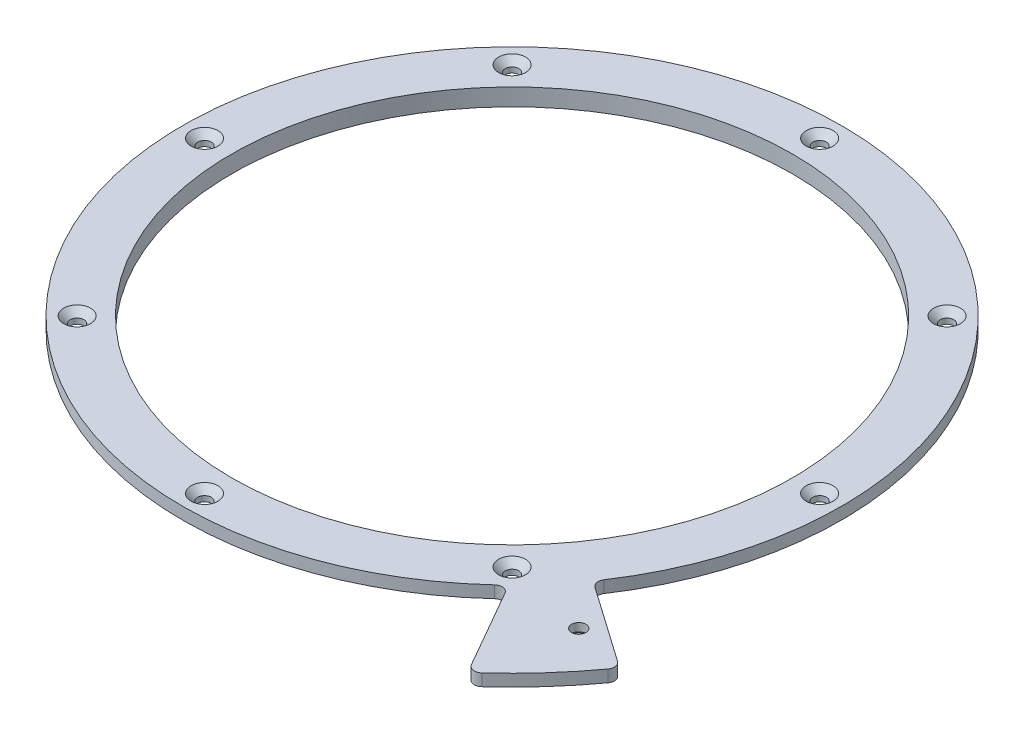
ISO-10303-21;
HEADER;
FILE_DESCRIPTION(('STEP AP214'),'2;1');
FILE_NAME('part.step','',(''),(''),'','','');
FILE_SCHEMA(('AUTOMOTIVE_DESIGN { 1 0 10303 214 1 1 1 1 }'));
ENDSEC;
DATA;
#1=APPLICATION_CONTEXT('core data for automotive mechanical design processes');
#2=APPLICATION_PROTOCOL_DEFINITION('international standard','automotive_design',2000,#1);
#3=PRODUCT_CONTEXT('',#1,'mechanical');
#4=PRODUCT('Part','Part','',(#3));
#5=PRODUCT_RELATED_PRODUCT_CATEGORY('part','',(#4));
#6=PRODUCT_DEFINITION_FORMATION('','',#4);
#7=PRODUCT_DEFINITION_CONTEXT('part definition',#1,'design');
#8=PRODUCT_DEFINITION('design','',#6,#7);
#9=PRODUCT_DEFINITION_SHAPE('','',#8);
#10=(LENGTH_UNIT() NAMED_UNIT(*) SI_UNIT(.MILLI.,.METRE.));
#11=(NAMED_UNIT(*) PLANE_ANGLE_UNIT() SI_UNIT($,.RADIAN.));
#12=(NAMED_UNIT(*) SI_UNIT($,.STERADIAN.) SOLID_ANGLE_UNIT());
#13=UNCERTAINTY_MEASURE_WITH_UNIT(LENGTH_MEASURE(1.E-05),#10,'distance_accuracy_value','');
#14=(GEOMETRIC_REPRESENTATION_CONTEXT(3) GLOBAL_UNCERTAINTY_ASSIGNED_CONTEXT((#13)) GLOBAL_UNIT_ASSIGNED_CONTEXT((#10,
#11,#12)) REPRESENTATION_CONTEXT('',''));
#15=CARTESIAN_POINT('',(0.,0.,0.));
#16=DIRECTION('',(0.,0.,1.));
#17=DIRECTION('',(1.,0.,0.));
#18=AXIS2_PLACEMENT_3D('',#15,#16,#17);
#19=CARTESIAN_POINT('',(0.,3.,0.));
#20=DIRECTION('',(0.,1.,0.));
#21=DIRECTION('',(0.,0.,1.));
#22=AXIS2_PLACEMENT_3D('',#19,#20,#21);
#23=PLANE('',#22);
#24=CARTESIAN_POINT('',(75.866996656666,3.,59.2265159041362));
#25=DIRECTION('',(0.,1.,0.));
#26=DIRECTION('',(0.,0.,1.));
#27=AXIS2_PLACEMENT_3D('',#24,#25,#26);
#28=CIRCLE('',#27,1.79999999999999);
#29=CARTESIAN_POINT('',(75.866996656666,3.,61.0265159041362));
#30=VERTEX_POINT('',#29);
#31=EDGE_CURVE('E260',#30,#30,#28,.T.);
#32=ORIENTED_EDGE('',*,*,#31,.F.);
#33=EDGE_LOOP('',(#32));
#34=FACE_BOUND('',#33,.T.);
#35=CARTESIAN_POINT('',(-76.76,3.,0.));
#36=DIRECTION('',(0.,1.,0.));
#37=DIRECTION('',(0.,0.,1.));
#38=AXIS2_PLACEMENT_3D('',#35,#36,#37);
#39=CIRCLE('',#38,3.36);
#40=CARTESIAN_POINT('',(-76.76,3.,3.36));
#41=VERTEX_POINT('',#40);
#42=EDGE_CURVE('E242',#41,#41,#39,.T.);
#43=ORIENTED_EDGE('',*,*,#42,.F.);
#44=EDGE_LOOP('',(#43));
#45=FACE_BOUND('',#44,.T.);
#46=CARTESIAN_POINT('',(-54.2775165238794,3.,-54.2775165238794));
#47=DIRECTION('',(0.,1.,0.));
#48=DIRECTION('',(0.,0.,1.));
#49=AXIS2_PLACEMENT_3D('',#46,#47,#48);
#50=CIRCLE('',#49,3.36);
#51=CARTESIAN_POINT('',(-54.2775165238794,3.,-50.9175165238794));
#52=VERTEX_POINT('',#51);
#53=EDGE_CURVE('E232',#52,#52,#50,.T.);
#54=ORIENTED_EDGE('',*,*,#53,.F.);
#55=EDGE_LOOP('',(#54));
#56=FACE_BOUND('',#55,.T.);
#57=CARTESIAN_POINT('',(0.,3.,-76.76));
#58=DIRECTION('',(0.,1.,0.));
#59=DIRECTION('',(0.,0.,1.));
#60=AXIS2_PLACEMENT_3D('',#57,#58,#59);
#61=CIRCLE('',#60,3.36);
#62=CARTESIAN_POINT('',(0.,3.,-73.4));
#63=VERTEX_POINT('',#62);
#64=EDGE_CURVE('E228',#63,#63,#61,.T.);
#65=ORIENTED_EDGE('',*,*,#64,.F.);
#66=EDGE_LOOP('',(#65));
#67=FACE_BOUND('',#66,.T.);
#68=CARTESIAN_POINT('',(54.2775165238794,3.,-54.2775165238794));
#69=DIRECTION('',(0.,1.,0.));
#70=DIRECTION('',(0.,0.,1.));
#71=AXIS2_PLACEMENT_3D('',#68,#69,#70);
#72=CIRCLE('',#71,3.36);
#73=CARTESIAN_POINT('',(54.2775165238794,3.,-50.9175165238794));
#74=VERTEX_POINT('',#73);
#75=EDGE_CURVE('E217',#74,#74,#72,.T.);
#76=ORIENTED_EDGE('',*,*,#75,.F.);
#77=EDGE_LOOP('',(#76));
#78=FACE_BOUND('',#77,.T.);
#79=CARTESIAN_POINT('',(76.76,3.,0.));
#80=DIRECTION('',(0.,1.,0.));
#81=DIRECTION('',(0.,0.,1.));
#82=AXIS2_PLACEMENT_3D('',#79,#80,#81);
#83=CIRCLE('',#82,3.36);
#84=CARTESIAN_POINT('',(76.76,3.,3.35999999999999));
#85=VERTEX_POINT('',#84);
#86=EDGE_CURVE('E206',#85,#85,#83,.T.);
#87=ORIENTED_EDGE('',*,*,#86,.F.);
#88=EDGE_LOOP('',(#87));
#89=FACE_BOUND('',#88,.T.);
#90=CARTESIAN_POINT('',(54.2775165238794,3.,54.2775165238794));
#91=DIRECTION('',(0.,1.,0.));
#92=DIRECTION('',(0.,0.,1.));
#93=AXIS2_PLACEMENT_3D('',#90,#91,#92);
#94=CIRCLE('',#93,3.36);
#95=CARTESIAN_POINT('',(54.2775165238794,3.,57.6375165238794));
#96=VERTEX_POINT('',#95);
#97=EDGE_CURVE('E198',#96,#96,#94,.T.);
#98=ORIENTED_EDGE('',*,*,#97,.F.);
#99=EDGE_LOOP('',(#98));
#100=FACE_BOUND('',#99,.T.);
#101=CARTESIAN_POINT('',(0.,3.,76.76));
#102=DIRECTION('',(0.,1.,0.));
#103=DIRECTION('',(0.,0.,1.));
#104=AXIS2_PLACEMENT_3D('',#101,#102,#103);
#105=CIRCLE('',#104,3.36);
#106=CARTESIAN_POINT('',(0.,3.,80.12));
#107=VERTEX_POINT('',#106);
#108=EDGE_CURVE('E188',#107,#107,#105,.T.);
#109=ORIENTED_EDGE('',*,*,#108,.F.);
#110=EDGE_LOOP('',(#109));
#111=FACE_BOUND('',#110,.T.);
#112=CARTESIAN_POINT('',(-54.2775165238794,3.,54.2775165238794));
#113=DIRECTION('',(0.,1.,0.));
#114=DIRECTION('',(0.,0.,1.));
#115=AXIS2_PLACEMENT_3D('',#112,#113,#114);
#116=CIRCLE('',#115,3.36);
#117=CARTESIAN_POINT('',(-54.2775165238794,3.,57.6375165238794));
#118=VERTEX_POINT('',#117);
#119=EDGE_CURVE('E181',#118,#118,#116,.T.);
#120=ORIENTED_EDGE('',*,*,#119,.F.);
#121=EDGE_LOOP('',(#120));
#122=FACE_BOUND('',#121,.T.);
#123=CARTESIAN_POINT('',(0.,3.,0.));
#124=DIRECTION('',(0.,1.,0.));
#125=DIRECTION('',(0.,0.,1.));
#126=AXIS2_PLACEMENT_3D('',#123,#124,#125);
#127=CIRCLE('',#126,109.237539335157);
#128=CARTESIAN_POINT('',(73.3680210890665,3.,80.9319064490284));
#129=VERTEX_POINT('',#128);
#130=CARTESIAN_POINT('',(88.2980425566925,3.,64.314039529923));
#131=VERTEX_POINT('',#130);
#132=EDGE_CURVE('E251',#129,#131,#127,.T.);
#133=ORIENTED_EDGE('',*,*,#132,.T.);
#134=CARTESIAN_POINT('',(86.6814180319349,3.,63.1365315061914));
#135=DIRECTION('',(0.,1.,0.));
#136=DIRECTION('',(0.,0.,1.));
#137=AXIS2_PLACEMENT_3D('',#134,#135,#136);
#138=CIRCLE('',#137,2.);
#139=CARTESIAN_POINT('',(87.828570904637,3.,61.4982274176134));
#140=VERTEX_POINT('',#139);
#141=EDGE_CURVE('E60',#131,#140,#138,.T.);
#142=ORIENTED_EDGE('',*,*,#141,.T.);
#143=DIRECTION('',(-0.819152044288989,0.,-0.573576436351051));
#144=VECTOR('',#143,1.);
#145=CARTESIAN_POINT('',(89.4821536594928,3.,62.6560785276171));
#146=LINE('',#145,#144);
#147=CARTESIAN_POINT('',(69.0023050743767,3.,48.3159341669251));
#148=VERTEX_POINT('',#147);
#149=EDGE_CURVE('E249',#140,#148,#146,.T.);
#150=ORIENTED_EDGE('',*,*,#149,.T.);
#151=CARTESIAN_POINT('',(70.1494579470788,3.,46.6776300783472));
#152=DIRECTION('',(0.,1.,0.));
#153=DIRECTION('',(0.,0.,1.));
#154=AXIS2_PLACEMENT_3D('',#151,#152,#153);
#155=CIRCLE('',#154,2.);
#156=CARTESIAN_POINT('',(68.4843865502813,3.,45.5696872803802));
#157=VERTEX_POINT('',#156);
#158=EDGE_CURVE('E140',#148,#157,#155,.F.);
#159=ORIENTED_EDGE('',*,*,#158,.T.);
#160=CARTESIAN_POINT('',(0.,3.,0.));
#161=DIRECTION('',(0.,1.,0.));
#162=DIRECTION('',(0.,0.,1.));
#163=AXIS2_PLACEMENT_3D('',#160,#161,#162);
#164=CIRCLE('',#163,82.26);
#165=CARTESIAN_POINT('',(55.9335518505812,3.,60.3170405223792));
#166=VERTEX_POINT('',#165);
#167=EDGE_CURVE('E120',#157,#166,#164,.T.);
#168=ORIENTED_EDGE('',*,*,#167,.T.);
#169=CARTESIAN_POINT('',(57.2934728778261,3.,61.7835379821988));
#170=DIRECTION('',(0.,1.,0.));
#171=DIRECTION('',(0.,0.,1.));
#172=AXIS2_PLACEMENT_3D('',#169,#170,#171);
#173=CIRCLE('',#172,2.);
#174=CARTESIAN_POINT('',(59.0288525702412,3.,60.7893260716117));
#175=VERTEX_POINT('',#174);
#176=EDGE_CURVE('E141',#166,#175,#173,.F.);
#177=ORIENTED_EDGE('',*,*,#176,.T.);
#178=DIRECTION('',(0.497105955293568,0.,0.867689846207543));
#179=VECTOR('',#178,1.);
#180=CARTESIAN_POINT('',(59.6286750276834,3.,61.8363057955671));
#181=LINE('',#180,#179);
#182=CARTESIAN_POINT('',(70.2893665199817,3.,80.4443583906232));
#183=VERTEX_POINT('',#182);
#184=EDGE_CURVE('E259',#175,#183,#181,.T.);
#185=ORIENTED_EDGE('',*,*,#184,.T.);
#186=CARTESIAN_POINT('',(72.0247462123967,3.,79.4501464800361));
#187=DIRECTION('',(0.,1.,0.));
#188=DIRECTION('',(0.,0.,1.));
#189=AXIS2_PLACEMENT_3D('',#186,#187,#188);
#190=CIRCLE('',#189,2.);
#191=EDGE_CURVE('E62',#183,#129,#190,.T.);
#192=ORIENTED_EDGE('',*,*,#191,.T.);
#193=EDGE_LOOP('',(#133,#142,#150,#159,#168,#177,#185,#192));
#194=FACE_BOUND('',#193,.T.);
#195=CARTESIAN_POINT('',(0.,3.,0.));
#196=DIRECTION('',(0.,1.,0.));
#197=DIRECTION('',(0.,0.,1.));
#198=AXIS2_PLACEMENT_3D('',#195,#196,#197);
#199=CIRCLE('',#198,70.);
#200=CARTESIAN_POINT('',(0.,3.,70.));
#201=VERTEX_POINT('',#200);
#202=EDGE_CURVE('E131',#201,#201,#199,.T.);
#203=ORIENTED_EDGE('',*,*,#202,.F.);
#204=EDGE_LOOP('',(#203));
#205=FACE_BOUND('',#204,.T.);
#206=ADVANCED_FACE('F41',(#34,#45,#56,#67,#78,#89,#100,#111,#122,#194,#205),#23,.T.);
#207=CARTESIAN_POINT('',(0.,0.,0.));
#208=DIRECTION('',(0.,1.,0.));
#209=DIRECTION('',(0.,0.,1.));
#210=AXIS2_PLACEMENT_3D('',#207,#208,#209);
#211=PLANE('',#210);
#212=CARTESIAN_POINT('',(75.866996656666,0.,59.2265159041362));
#213=DIRECTION('',(0.,1.,0.));
#214=DIRECTION('',(0.,0.,1.));
#215=AXIS2_PLACEMENT_3D('',#212,#213,#214);
#216=CIRCLE('',#215,2.79999999999988);
#217=CARTESIAN_POINT('',(75.866996656666,0.,62.0265159041361));
#218=VERTEX_POINT('',#217);
#219=EDGE_CURVE('E49',#218,#218,#216,.T.);
#220=ORIENTED_EDGE('',*,*,#219,.T.);
#221=EDGE_LOOP('',(#220));
#222=FACE_BOUND('',#221,.T.);
#223=CARTESIAN_POINT('',(-76.76,0.,0.));
#224=DIRECTION('',(0.,1.,0.));
#225=DIRECTION('',(0.,0.,1.));
#226=AXIS2_PLACEMENT_3D('',#223,#224,#225);
#227=CIRCLE('',#226,1.69999999999999);
#228=CARTESIAN_POINT('',(-76.76,0.,1.69999999999999));
#229=VERTEX_POINT('',#228);
#230=EDGE_CURVE('E238',#229,#229,#227,.T.);
#231=ORIENTED_EDGE('',*,*,#230,.T.);
#232=EDGE_LOOP('',(#231));
#233=FACE_BOUND('',#232,.T.);
#234=CARTESIAN_POINT('',(-54.2775165238794,0.,-54.2775165238794));
#235=DIRECTION('',(0.,1.,0.));
#236=DIRECTION('',(0.,0.,1.));
#237=AXIS2_PLACEMENT_3D('',#234,#235,#236);
#238=CIRCLE('',#237,1.7);
#239=CARTESIAN_POINT('',(-54.2775165238794,0.,-52.5775165238794));
#240=VERTEX_POINT('',#239);
#241=EDGE_CURVE('E230',#240,#240,#238,.T.);
#242=ORIENTED_EDGE('',*,*,#241,.T.);
#243=EDGE_LOOP('',(#242));
#244=FACE_BOUND('',#243,.T.);
#245=CARTESIAN_POINT('',(0.,0.,-76.76));
#246=DIRECTION('',(0.,1.,0.));
#247=DIRECTION('',(0.,0.,1.));
#248=AXIS2_PLACEMENT_3D('',#245,#246,#247);
#249=CIRCLE('',#248,1.7);
#250=CARTESIAN_POINT('',(0.,0.,-75.06));
#251=VERTEX_POINT('',#250);
#252=EDGE_CURVE('E220',#251,#251,#249,.T.);
#253=ORIENTED_EDGE('',*,*,#252,.T.);
#254=EDGE_LOOP('',(#253));
#255=FACE_BOUND('',#254,.T.);
#256=CARTESIAN_POINT('',(54.2775165238794,0.,-54.2775165238794));
#257=DIRECTION('',(0.,1.,0.));
#258=DIRECTION('',(0.,0.,1.));
#259=AXIS2_PLACEMENT_3D('',#256,#257,#258);
#260=CIRCLE('',#259,1.7);
#261=CARTESIAN_POINT('',(54.2775165238794,0.,-52.5775165238794));
#262=VERTEX_POINT('',#261);
#263=EDGE_CURVE('E214',#262,#262,#260,.T.);
#264=ORIENTED_EDGE('',*,*,#263,.T.);
#265=EDGE_LOOP('',(#264));
#266=FACE_BOUND('',#265,.T.);
#267=CARTESIAN_POINT('',(76.76,0.,0.));
#268=DIRECTION('',(0.,1.,0.));
#269=DIRECTION('',(0.,0.,1.));
#270=AXIS2_PLACEMENT_3D('',#267,#268,#269);
#271=CIRCLE('',#270,1.69999999999999);
#272=CARTESIAN_POINT('',(76.76,0.,1.69999999999998));
#273=VERTEX_POINT('',#272);
#274=EDGE_CURVE('E205',#273,#273,#271,.T.);
#275=ORIENTED_EDGE('',*,*,#274,.T.);
#276=EDGE_LOOP('',(#275));
#277=FACE_BOUND('',#276,.T.);
#278=CARTESIAN_POINT('',(54.2775165238794,0.,54.2775165238794));
#279=DIRECTION('',(0.,1.,0.));
#280=DIRECTION('',(0.,0.,1.));
#281=AXIS2_PLACEMENT_3D('',#278,#279,#280);
#282=CIRCLE('',#281,1.7);
#283=CARTESIAN_POINT('',(54.2775165238794,0.,55.9775165238794));
#284=VERTEX_POINT('',#283);
#285=EDGE_CURVE('E195',#284,#284,#282,.T.);
#286=ORIENTED_EDGE('',*,*,#285,.T.);
#287=EDGE_LOOP('',(#286));
#288=FACE_BOUND('',#287,.T.);
#289=CARTESIAN_POINT('',(0.,0.,76.76));
#290=DIRECTION('',(0.,1.,0.));
#291=DIRECTION('',(0.,0.,1.));
#292=AXIS2_PLACEMENT_3D('',#289,#290,#291);
#293=CIRCLE('',#292,1.7);
#294=CARTESIAN_POINT('',(0.,0.,78.46));
#295=VERTEX_POINT('',#294);
#296=EDGE_CURVE('E183',#295,#295,#293,.T.);
#297=ORIENTED_EDGE('',*,*,#296,.T.);
#298=EDGE_LOOP('',(#297));
#299=FACE_BOUND('',#298,.T.);
#300=CARTESIAN_POINT('',(-54.2775165238794,0.,54.2775165238794));
#301=DIRECTION('',(0.,1.,0.));
#302=DIRECTION('',(0.,0.,1.));
#303=AXIS2_PLACEMENT_3D('',#300,#301,#302);
#304=CIRCLE('',#303,1.7);
#305=CARTESIAN_POINT('',(-54.2775165238794,0.,55.9775165238794));
#306=VERTEX_POINT('',#305);
#307=EDGE_CURVE('E174',#306,#306,#304,.T.);
#308=ORIENTED_EDGE('',*,*,#307,.T.);
#309=EDGE_LOOP('',(#308));
#310=FACE_BOUND('',#309,.T.);
#311=CARTESIAN_POINT('',(0.,0.,0.));
#312=DIRECTION('',(0.,-1.,0.));
#313=DIRECTION('',(0.,0.,-1.));
#314=AXIS2_PLACEMENT_3D('',#311,#312,#313);
#315=CIRCLE('',#314,73.);
#316=CARTESIAN_POINT('',(0.,0.,-73.));
#317=VERTEX_POINT('',#316);
#318=EDGE_CURVE('E122',#317,#317,#315,.T.);
#319=ORIENTED_EDGE('',*,*,#318,.F.);
#320=EDGE_LOOP('',(#319));
#321=FACE_BOUND('',#320,.T.);
#322=DIRECTION('',(0.819152044288989,0.,0.573576436351051));
#323=VECTOR('',#322,1.);
#324=CARTESIAN_POINT('',(89.4821536594928,0.,62.6560785276171));
#325=LINE('',#324,#323);
#326=CARTESIAN_POINT('',(69.0023050743767,0.,48.3159341669251));
#327=VERTEX_POINT('',#326);
#328=CARTESIAN_POINT('',(87.828570904637,0.,61.4982274176134));
#329=VERTEX_POINT('',#328);
#330=EDGE_CURVE('E248',#327,#329,#325,.T.);
#331=ORIENTED_EDGE('',*,*,#330,.T.);
#332=CARTESIAN_POINT('',(86.6814180319349,0.,63.1365315061914));
#333=DIRECTION('',(0.,1.,0.));
#334=DIRECTION('',(0.,0.,1.));
#335=AXIS2_PLACEMENT_3D('',#332,#333,#334);
#336=CIRCLE('',#335,2.);
#337=CARTESIAN_POINT('',(88.2980425566925,0.,64.314039529923));
#338=VERTEX_POINT('',#337);
#339=EDGE_CURVE('E143',#329,#338,#336,.F.);
#340=ORIENTED_EDGE('',*,*,#339,.T.);
#341=CARTESIAN_POINT('',(0.,0.,0.));
#342=DIRECTION('',(0.,1.,0.));
#343=DIRECTION('',(0.,0.,1.));
#344=AXIS2_PLACEMENT_3D('',#341,#342,#343);
#345=CIRCLE('',#344,109.237539335157);
#346=CARTESIAN_POINT('',(73.3680210890665,0.,80.9319064490284));
#347=VERTEX_POINT('',#346);
#348=EDGE_CURVE('E254',#338,#347,#345,.F.);
#349=ORIENTED_EDGE('',*,*,#348,.T.);
#350=CARTESIAN_POINT('',(72.0247462123967,0.,79.4501464800361));
#351=DIRECTION('',(0.,1.,0.));
#352=DIRECTION('',(0.,0.,1.));
#353=AXIS2_PLACEMENT_3D('',#350,#351,#352);
#354=CIRCLE('',#353,2.);
#355=CARTESIAN_POINT('',(70.2893665199817,0.,80.4443583906232));
#356=VERTEX_POINT('',#355);
#357=EDGE_CURVE('E146',#347,#356,#354,.F.);
#358=ORIENTED_EDGE('',*,*,#357,.T.);
#359=DIRECTION('',(-0.497105955293568,0.,-0.867689846207543));
#360=VECTOR('',#359,1.);
#361=CARTESIAN_POINT('',(59.6286750276834,0.,61.8363057955671));
#362=LINE('',#361,#360);
#363=CARTESIAN_POINT('',(59.0288525702412,0.,60.7893260716117));
#364=VERTEX_POINT('',#363);
#365=EDGE_CURVE('E250',#356,#364,#362,.T.);
#366=ORIENTED_EDGE('',*,*,#365,.T.);
#367=CARTESIAN_POINT('',(57.2934728778261,0.,61.7835379821988));
#368=DIRECTION('',(0.,1.,0.));
#369=DIRECTION('',(0.,0.,1.));
#370=AXIS2_PLACEMENT_3D('',#367,#368,#369);
#371=CIRCLE('',#370,2.);
#372=CARTESIAN_POINT('',(55.9335518505812,0.,60.3170405223792));
#373=VERTEX_POINT('',#372);
#374=EDGE_CURVE('E127',#364,#373,#371,.T.);
#375=ORIENTED_EDGE('',*,*,#374,.T.);
#376=CARTESIAN_POINT('',(0.,0.,0.));
#377=DIRECTION('',(0.,1.,0.));
#378=DIRECTION('',(0.,0.,1.));
#379=AXIS2_PLACEMENT_3D('',#376,#377,#378);
#380=CIRCLE('',#379,82.26);
#381=CARTESIAN_POINT('',(68.4843865502813,0.,45.5696872803802));
#382=VERTEX_POINT('',#381);
#383=EDGE_CURVE('E112',#382,#373,#380,.T.);
#384=ORIENTED_EDGE('',*,*,#383,.F.);
#385=CARTESIAN_POINT('',(70.1494579470788,0.,46.6776300783472));
#386=DIRECTION('',(0.,1.,0.));
#387=DIRECTION('',(0.,0.,1.));
#388=AXIS2_PLACEMENT_3D('',#385,#386,#387);
#389=CIRCLE('',#388,2.);
#390=EDGE_CURVE('E129',#382,#327,#389,.T.);
#391=ORIENTED_EDGE('',*,*,#390,.T.);
#392=EDGE_LOOP('',(#331,#340,#349,#358,#366,#375,#384,#391));
#393=FACE_BOUND('',#392,.T.);
#394=ADVANCED_FACE('F123',(#222,#233,#244,#255,#266,#277,#288,#299,#310,#321,#393),#211,.F.);
#395=CARTESIAN_POINT('',(0.,3.,0.));
#396=DIRECTION('',(0.,-1.,0.));
#397=DIRECTION('',(0.,0.,-1.));
#398=AXIS2_PLACEMENT_3D('',#395,#396,#397);
#399=CYLINDRICAL_SURFACE('',#398,82.26);
#400=ORIENTED_EDGE('',*,*,#383,.T.);
#401=DIRECTION('',(0.,-1.,0.));
#402=VECTOR('',#401,1.);
#403=CARTESIAN_POINT('',(55.9335518505813,3.,60.3170405223792));
#404=LINE('',#403,#402);
#405=EDGE_CURVE('E119',#373,#166,#404,.F.);
#406=ORIENTED_EDGE('',*,*,#405,.T.);
#407=ORIENTED_EDGE('',*,*,#167,.F.);
#408=DIRECTION('',(0.,-1.,0.));
#409=VECTOR('',#408,1.);
#410=CARTESIAN_POINT('',(68.4843865502813,3.,45.5696872803802));
#411=LINE('',#410,#409);
#412=EDGE_CURVE('E109',#157,#382,#411,.T.);
#413=ORIENTED_EDGE('',*,*,#412,.T.);
#414=EDGE_LOOP('',(#400,#406,#407,#413));
#415=FACE_BOUND('',#414,.T.);
#416=ADVANCED_FACE('F115',(#415),#399,.T.);
#417=CARTESIAN_POINT('',(0.,3.,0.));
#418=DIRECTION('',(0.,-1.,0.));
#419=DIRECTION('',(0.,0.,-1.));
#420=AXIS2_PLACEMENT_3D('',#417,#418,#419);
#421=CYLINDRICAL_SURFACE('',#420,70.);
#422=ORIENTED_EDGE('',*,*,#202,.T.);
#423=EDGE_LOOP('',(#422));
#424=FACE_BOUND('',#423,.T.);
#425=CARTESIAN_POINT('',(0.,-1.3,0.));
#426=DIRECTION('',(0.,-1.,0.));
#427=DIRECTION('',(0.,0.,-1.));
#428=AXIS2_PLACEMENT_3D('',#425,#426,#427);
#429=CIRCLE('',#428,70.);
#430=CARTESIAN_POINT('',(0.,-1.3,-70.));
#431=VERTEX_POINT('',#430);
#432=EDGE_CURVE('E175',#431,#431,#429,.T.);
#433=ORIENTED_EDGE('',*,*,#432,.T.);
#434=EDGE_LOOP('',(#433));
#435=FACE_BOUND('',#434,.T.);
#436=ADVANCED_FACE('F286',(#424,#435),#421,.F.);
#437=CARTESIAN_POINT('',(0.,-1.3,0.));
#438=DIRECTION('',(0.,-1.,0.));
#439=DIRECTION('',(0.,0.,-1.));
#440=AXIS2_PLACEMENT_3D('',#437,#438,#439);
#441=PLANE('',#440);
#442=CARTESIAN_POINT('',(0.,-1.3,0.));
#443=DIRECTION('',(0.,-1.,0.));
#444=DIRECTION('',(0.,0.,-1.));
#445=AXIS2_PLACEMENT_3D('',#442,#443,#444);
#446=CIRCLE('',#445,73.);
#447=CARTESIAN_POINT('',(0.,-1.3,-73.));
#448=VERTEX_POINT('',#447);
#449=EDGE_CURVE('E170',#448,#448,#446,.T.);
#450=ORIENTED_EDGE('',*,*,#449,.T.);
#451=EDGE_LOOP('',(#450));
#452=FACE_BOUND('',#451,.T.);
#453=ORIENTED_EDGE('',*,*,#432,.F.);
#454=EDGE_LOOP('',(#453));
#455=FACE_BOUND('',#454,.T.);
#456=ADVANCED_FACE('F293',(#452,#455),#441,.T.);
#457=CARTESIAN_POINT('',(0.,-1.3,0.));
#458=DIRECTION('',(0.,1.,0.));
#459=DIRECTION('',(0.,0.,1.));
#460=AXIS2_PLACEMENT_3D('',#457,#458,#459);
#461=CYLINDRICAL_SURFACE('',#460,73.);
#462=ORIENTED_EDGE('',*,*,#449,.F.);
#463=EDGE_LOOP('',(#462));
#464=FACE_BOUND('',#463,.T.);
#465=ORIENTED_EDGE('',*,*,#318,.T.);
#466=EDGE_LOOP('',(#465));
#467=FACE_BOUND('',#466,.T.);
#468=ADVANCED_FACE('F298',(#464,#467),#461,.T.);
#469=CARTESIAN_POINT('',(-54.2775165238794,3.,54.2775165238794));
#470=DIRECTION('',(0.,1.,0.));
#471=DIRECTION('',(0.,0.,1.));
#472=AXIS2_PLACEMENT_3D('',#469,#470,#471);
#473=CYLINDRICAL_SURFACE('',#472,1.7);
#474=ORIENTED_EDGE('',*,*,#307,.F.);
#475=EDGE_LOOP('',(#474));
#476=FACE_BOUND('',#475,.T.);
#477=CARTESIAN_POINT('',(-54.2775165238794,1.34,54.2775165238794));
#478=DIRECTION('',(0.,1.,0.));
#479=DIRECTION('',(0.,0.,1.));
#480=AXIS2_PLACEMENT_3D('',#477,#478,#479);
#481=CIRCLE('',#480,1.7);
#482=CARTESIAN_POINT('',(-54.2775165238794,1.34,55.9775165238794));
#483=VERTEX_POINT('',#482);
#484=EDGE_CURVE('E178',#483,#483,#481,.T.);
#485=ORIENTED_EDGE('',*,*,#484,.T.);
#486=EDGE_LOOP('',(#485));
#487=FACE_BOUND('',#486,.T.);
#488=ADVANCED_FACE('F305',(#476,#487),#473,.F.);
#489=CARTESIAN_POINT('',(-54.2775165238794,3.,54.2775165238794));
#490=DIRECTION('',(0.,1.,0.));
#491=DIRECTION('',(0.,0.,1.));
#492=AXIS2_PLACEMENT_3D('',#489,#490,#491);
#493=CONICAL_SURFACE('',#492,3.36,0.785398163397448);
#494=ORIENTED_EDGE('',*,*,#484,.F.);
#495=EDGE_LOOP('',(#494));
#496=FACE_BOUND('',#495,.T.);
#497=ORIENTED_EDGE('',*,*,#119,.T.);
#498=EDGE_LOOP('',(#497));
#499=FACE_BOUND('',#498,.T.);
#500=ADVANCED_FACE('F406',(#496,#499),#493,.F.);
#501=CARTESIAN_POINT('',(0.,3.,76.76));
#502=DIRECTION('',(0.,1.,0.));
#503=DIRECTION('',(0.,0.,1.));
#504=AXIS2_PLACEMENT_3D('',#501,#502,#503);
#505=CYLINDRICAL_SURFACE('',#504,1.7);
#506=ORIENTED_EDGE('',*,*,#296,.F.);
#507=EDGE_LOOP('',(#506));
#508=FACE_BOUND('',#507,.T.);
#509=CARTESIAN_POINT('',(0.,1.34,76.76));
#510=DIRECTION('',(0.,1.,0.));
#511=DIRECTION('',(0.,0.,1.));
#512=AXIS2_PLACEMENT_3D('',#509,#510,#511);
#513=CIRCLE('',#512,1.7);
#514=CARTESIAN_POINT('',(0.,1.34,78.46));
#515=VERTEX_POINT('',#514);
#516=EDGE_CURVE('E190',#515,#515,#513,.T.);
#517=ORIENTED_EDGE('',*,*,#516,.T.);
#518=EDGE_LOOP('',(#517));
#519=FACE_BOUND('',#518,.T.);
#520=ADVANCED_FACE('F404',(#508,#519),#505,.F.);
#521=CARTESIAN_POINT('',(0.,3.,76.76));
#522=DIRECTION('',(0.,1.,0.));
#523=DIRECTION('',(0.,0.,1.));
#524=AXIS2_PLACEMENT_3D('',#521,#522,#523);
#525=CONICAL_SURFACE('',#524,3.36,0.785398163397448);
#526=ORIENTED_EDGE('',*,*,#516,.F.);
#527=EDGE_LOOP('',(#526));
#528=FACE_BOUND('',#527,.T.);
#529=ORIENTED_EDGE('',*,*,#108,.T.);
#530=EDGE_LOOP('',(#529));
#531=FACE_BOUND('',#530,.T.);
#532=ADVANCED_FACE('F399',(#528,#531),#525,.F.);
#533=CARTESIAN_POINT('',(54.2775165238794,3.,54.2775165238794));
#534=DIRECTION('',(0.,1.,0.));
#535=DIRECTION('',(0.,0.,1.));
#536=AXIS2_PLACEMENT_3D('',#533,#534,#535);
#537=CYLINDRICAL_SURFACE('',#536,1.7);
#538=ORIENTED_EDGE('',*,*,#285,.F.);
#539=EDGE_LOOP('',(#538));
#540=FACE_BOUND('',#539,.T.);
#541=CARTESIAN_POINT('',(54.2775165238794,1.34,54.2775165238794));
#542=DIRECTION('',(0.,1.,0.));
#543=DIRECTION('',(0.,0.,1.));
#544=AXIS2_PLACEMENT_3D('',#541,#542,#543);
#545=CIRCLE('',#544,1.7);
#546=CARTESIAN_POINT('',(54.2775165238794,1.34,55.9775165238794));
#547=VERTEX_POINT('',#546);
#548=EDGE_CURVE('E196',#547,#547,#545,.T.);
#549=ORIENTED_EDGE('',*,*,#548,.T.);
#550=EDGE_LOOP('',(#549));
#551=FACE_BOUND('',#550,.T.);
#552=ADVANCED_FACE('F398',(#540,#551),#537,.F.);
#553=CARTESIAN_POINT('',(54.2775165238794,3.,54.2775165238794));
#554=DIRECTION('',(0.,1.,0.));
#555=DIRECTION('',(0.,0.,1.));
#556=AXIS2_PLACEMENT_3D('',#553,#554,#555);
#557=CONICAL_SURFACE('',#556,3.36,0.785398163397448);
#558=ORIENTED_EDGE('',*,*,#548,.F.);
#559=EDGE_LOOP('',(#558));
#560=FACE_BOUND('',#559,.T.);
#561=ORIENTED_EDGE('',*,*,#97,.T.);
#562=EDGE_LOOP('',(#561));
#563=FACE_BOUND('',#562,.T.);
#564=ADVANCED_FACE('F392',(#560,#563),#557,.F.);
#565=CARTESIAN_POINT('',(76.76,3.,0.));
#566=DIRECTION('',(0.,1.,0.));
#567=DIRECTION('',(0.,0.,1.));
#568=AXIS2_PLACEMENT_3D('',#565,#566,#567);
#569=CYLINDRICAL_SURFACE('',#568,1.69999999999999);
#570=ORIENTED_EDGE('',*,*,#274,.F.);
#571=EDGE_LOOP('',(#570));
#572=FACE_BOUND('',#571,.T.);
#573=CARTESIAN_POINT('',(76.76,1.34,0.));
#574=DIRECTION('',(0.,1.,0.));
#575=DIRECTION('',(0.,0.,1.));
#576=AXIS2_PLACEMENT_3D('',#573,#574,#575);
#577=CIRCLE('',#576,1.69999999999999);
#578=CARTESIAN_POINT('',(76.76,1.34,1.69999999999998));
#579=VERTEX_POINT('',#578);
#580=EDGE_CURVE('E204',#579,#579,#577,.T.);
#581=ORIENTED_EDGE('',*,*,#580,.T.);
#582=EDGE_LOOP('',(#581));
#583=FACE_BOUND('',#582,.T.);
#584=ADVANCED_FACE('F390',(#572,#583),#569,.F.);
#585=CARTESIAN_POINT('',(76.76,3.,0.));
#586=DIRECTION('',(0.,1.,0.));
#587=DIRECTION('',(0.,0.,1.));
#588=AXIS2_PLACEMENT_3D('',#585,#586,#587);
#589=CONICAL_SURFACE('',#588,3.36,0.78539816339745);
#590=ORIENTED_EDGE('',*,*,#580,.F.);
#591=EDGE_LOOP('',(#590));
#592=FACE_BOUND('',#591,.T.);
#593=ORIENTED_EDGE('',*,*,#86,.T.);
#594=EDGE_LOOP('',(#593));
#595=FACE_BOUND('',#594,.T.);
#596=ADVANCED_FACE('F381',(#592,#595),#589,.F.);
#597=CARTESIAN_POINT('',(54.2775165238794,3.,-54.2775165238794));
#598=DIRECTION('',(0.,1.,0.));
#599=DIRECTION('',(0.,0.,1.));
#600=AXIS2_PLACEMENT_3D('',#597,#598,#599);
#601=CYLINDRICAL_SURFACE('',#600,1.7);
#602=ORIENTED_EDGE('',*,*,#263,.F.);
#603=EDGE_LOOP('',(#602));
#604=FACE_BOUND('',#603,.T.);
#605=CARTESIAN_POINT('',(54.2775165238794,1.34,-54.2775165238794));
#606=DIRECTION('',(0.,1.,0.));
#607=DIRECTION('',(0.,0.,1.));
#608=AXIS2_PLACEMENT_3D('',#605,#606,#607);
#609=CIRCLE('',#608,1.7);
#610=CARTESIAN_POINT('',(54.2775165238794,1.34,-52.5775165238794));
#611=VERTEX_POINT('',#610);
#612=EDGE_CURVE('E213',#611,#611,#609,.T.);
#613=ORIENTED_EDGE('',*,*,#612,.T.);
#614=EDGE_LOOP('',(#613));
#615=FACE_BOUND('',#614,.T.);
#616=ADVANCED_FACE('F379',(#604,#615),#601,.F.);
#617=CARTESIAN_POINT('',(54.2775165238794,3.,-54.2775165238794));
#618=DIRECTION('',(0.,1.,0.));
#619=DIRECTION('',(0.,0.,1.));
#620=AXIS2_PLACEMENT_3D('',#617,#618,#619);
#621=CONICAL_SURFACE('',#620,3.36,0.785398163397448);
#622=ORIENTED_EDGE('',*,*,#612,.F.);
#623=EDGE_LOOP('',(#622));
#624=FACE_BOUND('',#623,.T.);
#625=ORIENTED_EDGE('',*,*,#75,.T.);
#626=EDGE_LOOP('',(#625));
#627=FACE_BOUND('',#626,.T.);
#628=ADVANCED_FACE('F376',(#624,#627),#621,.F.);
#629=CARTESIAN_POINT('',(0.,3.,-76.76));
#630=DIRECTION('',(0.,1.,0.));
#631=DIRECTION('',(0.,0.,1.));
#632=AXIS2_PLACEMENT_3D('',#629,#630,#631);
#633=CYLINDRICAL_SURFACE('',#632,1.7);
#634=ORIENTED_EDGE('',*,*,#252,.F.);
#635=EDGE_LOOP('',(#634));
#636=FACE_BOUND('',#635,.T.);
#637=CARTESIAN_POINT('',(0.,1.34,-76.76));
#638=DIRECTION('',(0.,1.,0.));
#639=DIRECTION('',(0.,0.,1.));
#640=AXIS2_PLACEMENT_3D('',#637,#638,#639);
#641=CIRCLE('',#640,1.7);
#642=CARTESIAN_POINT('',(0.,1.34,-75.06));
#643=VERTEX_POINT('',#642);
#644=EDGE_CURVE('E221',#643,#643,#641,.T.);
#645=ORIENTED_EDGE('',*,*,#644,.T.);
#646=EDGE_LOOP('',(#645));
#647=FACE_BOUND('',#646,.T.);
#648=ADVANCED_FACE('F375',(#636,#647),#633,.F.);
#649=CARTESIAN_POINT('',(0.,3.,-76.76));
#650=DIRECTION('',(0.,1.,0.));
#651=DIRECTION('',(0.,0.,1.));
#652=AXIS2_PLACEMENT_3D('',#649,#650,#651);
#653=CONICAL_SURFACE('',#652,3.36,0.785398163397448);
#654=ORIENTED_EDGE('',*,*,#644,.F.);
#655=EDGE_LOOP('',(#654));
#656=FACE_BOUND('',#655,.T.);
#657=ORIENTED_EDGE('',*,*,#64,.T.);
#658=EDGE_LOOP('',(#657));
#659=FACE_BOUND('',#658,.T.);
#660=ADVANCED_FACE('F368',(#656,#659),#653,.F.);
#661=CARTESIAN_POINT('',(-54.2775165238794,3.,-54.2775165238794));
#662=DIRECTION('',(0.,1.,0.));
#663=DIRECTION('',(0.,0.,1.));
#664=AXIS2_PLACEMENT_3D('',#661,#662,#663);
#665=CYLINDRICAL_SURFACE('',#664,1.7);
#666=ORIENTED_EDGE('',*,*,#241,.F.);
#667=EDGE_LOOP('',(#666));
#668=FACE_BOUND('',#667,.T.);
#669=CARTESIAN_POINT('',(-54.2775165238794,1.34,-54.2775165238794));
#670=DIRECTION('',(0.,1.,0.));
#671=DIRECTION('',(0.,0.,1.));
#672=AXIS2_PLACEMENT_3D('',#669,#670,#671);
#673=CIRCLE('',#672,1.7);
#674=CARTESIAN_POINT('',(-54.2775165238794,1.34,-52.5775165238794));
#675=VERTEX_POINT('',#674);
#676=EDGE_CURVE('E235',#675,#675,#673,.T.);
#677=ORIENTED_EDGE('',*,*,#676,.T.);
#678=EDGE_LOOP('',(#677));
#679=FACE_BOUND('',#678,.T.);
#680=ADVANCED_FACE('F364',(#668,#679),#665,.F.);
#681=CARTESIAN_POINT('',(-54.2775165238794,3.,-54.2775165238794));
#682=DIRECTION('',(0.,1.,0.));
#683=DIRECTION('',(0.,0.,1.));
#684=AXIS2_PLACEMENT_3D('',#681,#682,#683);
#685=CONICAL_SURFACE('',#684,3.36,0.785398163397448);
#686=ORIENTED_EDGE('',*,*,#676,.F.);
#687=EDGE_LOOP('',(#686));
#688=FACE_BOUND('',#687,.T.);
#689=ORIENTED_EDGE('',*,*,#53,.T.);
#690=EDGE_LOOP('',(#689));
#691=FACE_BOUND('',#690,.T.);
#692=ADVANCED_FACE('F359',(#688,#691),#685,.F.);
#693=CARTESIAN_POINT('',(-76.76,3.,0.));
#694=DIRECTION('',(0.,1.,0.));
#695=DIRECTION('',(0.,0.,1.));
#696=AXIS2_PLACEMENT_3D('',#693,#694,#695);
#697=CYLINDRICAL_SURFACE('',#696,1.69999999999999);
#698=ORIENTED_EDGE('',*,*,#230,.F.);
#699=EDGE_LOOP('',(#698));
#700=FACE_BOUND('',#699,.T.);
#701=CARTESIAN_POINT('',(-76.76,1.34,0.));
#702=DIRECTION('',(0.,1.,0.));
#703=DIRECTION('',(0.,0.,1.));
#704=AXIS2_PLACEMENT_3D('',#701,#702,#703);
#705=CIRCLE('',#704,1.69999999999999);
#706=CARTESIAN_POINT('',(-76.76,1.34,1.69999999999999));
#707=VERTEX_POINT('',#706);
#708=EDGE_CURVE('E241',#707,#707,#705,.T.);
#709=ORIENTED_EDGE('',*,*,#708,.T.);
#710=EDGE_LOOP('',(#709));
#711=FACE_BOUND('',#710,.T.);
#712=ADVANCED_FACE('F358',(#700,#711),#697,.F.);
#713=CARTESIAN_POINT('',(-76.76,3.,0.));
#714=DIRECTION('',(0.,1.,0.));
#715=DIRECTION('',(0.,0.,1.));
#716=AXIS2_PLACEMENT_3D('',#713,#714,#715);
#717=CONICAL_SURFACE('',#716,3.36,0.78539816339745);
#718=ORIENTED_EDGE('',*,*,#708,.F.);
#719=EDGE_LOOP('',(#718));
#720=FACE_BOUND('',#719,.T.);
#721=ORIENTED_EDGE('',*,*,#42,.T.);
#722=EDGE_LOOP('',(#721));
#723=FACE_BOUND('',#722,.T.);
#724=ADVANCED_FACE('F353',(#720,#723),#717,.F.);
#725=CARTESIAN_POINT('',(89.4821536594928,-47.5308212191584,62.6560785276171));
#726=DIRECTION('',(0.573576436351051,0.,-0.819152044288989));
#727=DIRECTION('',(-0.819152044288989,0.,-0.573576436351051));
#728=AXIS2_PLACEMENT_3D('',#725,#726,#727);
#729=PLANE('',#728);
#730=ORIENTED_EDGE('',*,*,#330,.F.);
#731=DIRECTION('',(0.,-1.,0.));
#732=VECTOR('',#731,1.);
#733=CARTESIAN_POINT('',(69.0023050743767,-47.5308212191584,48.3159341669251));
#734=LINE('',#733,#732);
#735=EDGE_CURVE('E138',#327,#148,#734,.F.);
#736=ORIENTED_EDGE('',*,*,#735,.T.);
#737=ORIENTED_EDGE('',*,*,#149,.F.);
#738=DIRECTION('',(0.,1.,0.));
#739=VECTOR('',#738,1.);
#740=CARTESIAN_POINT('',(87.828570904637,-47.5308212191584,61.4982274176134));
#741=LINE('',#740,#739);
#742=EDGE_CURVE('E158',#140,#329,#741,.F.);
#743=ORIENTED_EDGE('',*,*,#742,.T.);
#744=EDGE_LOOP('',(#730,#736,#737,#743));
#745=FACE_BOUND('',#744,.T.);
#746=ADVANCED_FACE('F338',(#745),#729,.T.);
#747=CARTESIAN_POINT('',(0.,-47.5308212191584,0.));
#748=DIRECTION('',(0.,1.,0.));
#749=DIRECTION('',(0.,0.,1.));
#750=AXIS2_PLACEMENT_3D('',#747,#748,#749);
#751=CYLINDRICAL_SURFACE('',#750,109.237539335157);
#752=ORIENTED_EDGE('',*,*,#348,.F.);
#753=DIRECTION('',(0.,1.,0.));
#754=VECTOR('',#753,1.);
#755=CARTESIAN_POINT('',(88.2980425566925,-47.5308212191584,64.314039529923));
#756=LINE('',#755,#754);
#757=EDGE_CURVE('E151',#338,#131,#756,.T.);
#758=ORIENTED_EDGE('',*,*,#757,.T.);
#759=ORIENTED_EDGE('',*,*,#132,.F.);
#760=DIRECTION('',(0.,1.,0.));
#761=VECTOR('',#760,1.);
#762=CARTESIAN_POINT('',(73.3680210890665,-47.5308212191584,80.9319064490284));
#763=LINE('',#762,#761);
#764=EDGE_CURVE('E154',#129,#347,#763,.F.);
#765=ORIENTED_EDGE('',*,*,#764,.T.);
#766=EDGE_LOOP('',(#752,#758,#759,#765));
#767=FACE_BOUND('',#766,.T.);
#768=ADVANCED_FACE('F345',(#767),#751,.T.);
#769=CARTESIAN_POINT('',(59.6286750276834,-47.5308212191584,61.8363057955671));
#770=DIRECTION('',(-0.867689846207543,0.,0.497105955293568));
#771=DIRECTION('',(0.497105955293568,0.,0.867689846207543));
#772=AXIS2_PLACEMENT_3D('',#769,#770,#771);
#773=PLANE('',#772);
#774=ORIENTED_EDGE('',*,*,#184,.F.);
#775=DIRECTION('',(0.,-1.,0.));
#776=VECTOR('',#775,1.);
#777=CARTESIAN_POINT('',(59.0288525702412,-47.5308212191584,60.7893260716117));
#778=LINE('',#777,#776);
#779=EDGE_CURVE('E156',#175,#364,#778,.T.);
#780=ORIENTED_EDGE('',*,*,#779,.T.);
#781=ORIENTED_EDGE('',*,*,#365,.F.);
#782=DIRECTION('',(0.,1.,0.));
#783=VECTOR('',#782,1.);
#784=CARTESIAN_POINT('',(70.2893665199817,-47.5308212191584,80.4443583906232));
#785=LINE('',#784,#783);
#786=EDGE_CURVE('E159',#356,#183,#785,.T.);
#787=ORIENTED_EDGE('',*,*,#786,.T.);
#788=EDGE_LOOP('',(#774,#780,#781,#787));
#789=FACE_BOUND('',#788,.T.);
#790=ADVANCED_FACE('F317',(#789),#773,.T.);
#791=CARTESIAN_POINT('',(57.2934728778261,3.,61.7835379821988));
#792=DIRECTION('',(0.,-1.,0.));
#793=DIRECTION('',(0.,0.,-1.));
#794=AXIS2_PLACEMENT_3D('',#791,#792,#793);
#795=CYLINDRICAL_SURFACE('',#794,2.);
#796=ORIENTED_EDGE('',*,*,#374,.F.);
#797=ORIENTED_EDGE('',*,*,#779,.F.);
#798=ORIENTED_EDGE('',*,*,#176,.F.);
#799=ORIENTED_EDGE('',*,*,#405,.F.);
#800=EDGE_LOOP('',(#796,#797,#798,#799));
#801=FACE_BOUND('',#800,.T.);
#802=ADVANCED_FACE('F312',(#801),#795,.F.);
#803=CARTESIAN_POINT('',(70.1494579470788,3.,46.6776300783472));
#804=DIRECTION('',(0.,-1.,0.));
#805=DIRECTION('',(0.,0.,-1.));
#806=AXIS2_PLACEMENT_3D('',#803,#804,#805);
#807=CYLINDRICAL_SURFACE('',#806,2.);
#808=ORIENTED_EDGE('',*,*,#390,.F.);
#809=ORIENTED_EDGE('',*,*,#412,.F.);
#810=ORIENTED_EDGE('',*,*,#158,.F.);
#811=ORIENTED_EDGE('',*,*,#735,.F.);
#812=EDGE_LOOP('',(#808,#809,#810,#811));
#813=FACE_BOUND('',#812,.T.);
#814=ADVANCED_FACE('F133',(#813),#807,.F.);
#815=CARTESIAN_POINT('',(86.6814180319349,-47.5308212191584,63.1365315061914));
#816=DIRECTION('',(0.,1.,0.));
#817=DIRECTION('',(0.,0.,1.));
#818=AXIS2_PLACEMENT_3D('',#815,#816,#817);
#819=CYLINDRICAL_SURFACE('',#818,2.);
#820=ORIENTED_EDGE('',*,*,#339,.F.);
#821=ORIENTED_EDGE('',*,*,#742,.F.);
#822=ORIENTED_EDGE('',*,*,#141,.F.);
#823=ORIENTED_EDGE('',*,*,#757,.F.);
#824=EDGE_LOOP('',(#820,#821,#822,#823));
#825=FACE_BOUND('',#824,.T.);
#826=ADVANCED_FACE('F318',(#825),#819,.T.);
#827=CARTESIAN_POINT('',(72.0247462123967,-47.5308212191584,79.4501464800361));
#828=DIRECTION('',(0.,1.,0.));
#829=DIRECTION('',(0.,0.,1.));
#830=AXIS2_PLACEMENT_3D('',#827,#828,#829);
#831=CYLINDRICAL_SURFACE('',#830,2.);
#832=ORIENTED_EDGE('',*,*,#357,.F.);
#833=ORIENTED_EDGE('',*,*,#764,.F.);
#834=ORIENTED_EDGE('',*,*,#191,.F.);
#835=ORIENTED_EDGE('',*,*,#786,.F.);
#836=EDGE_LOOP('',(#832,#833,#834,#835));
#837=FACE_BOUND('',#836,.T.);
#838=ADVANCED_FACE('F321',(#837),#831,.T.);
#839=CARTESIAN_POINT('',(75.866996656666,-1.3,59.2265159041362));
#840=DIRECTION('',(0.,1.,0.));
#841=DIRECTION('',(0.,0.,1.));
#842=AXIS2_PLACEMENT_3D('',#839,#840,#841);
#843=CYLINDRICAL_SURFACE('',#842,1.79999999999999);
#844=CARTESIAN_POINT('',(75.866996656666,0.999999999999899,59.2265159041362));
#845=DIRECTION('',(0.,1.,0.));
#846=DIRECTION('',(0.,0.,1.));
#847=AXIS2_PLACEMENT_3D('',#844,#845,#846);
#848=CIRCLE('',#847,1.79999999999999);
#849=CARTESIAN_POINT('',(75.866996656666,0.999999999999899,61.0265159041362));
#850=VERTEX_POINT('',#849);
#851=EDGE_CURVE('E11',#850,#850,#848,.F.);
#852=CARTESIAN_POINT('',(75.866996656666,0.999999999999899,61.0265159041362));
#853=CARTESIAN_POINT('',(75.866996656666,1.02083333333323,61.0265159041362));
#854=CARTESIAN_POINT('',(75.866996656666,1.04166666666657,61.0265159041362));
#855=CARTESIAN_POINT('',(75.866996656666,1.08333333333324,61.0265159041362));
#856=CARTESIAN_POINT('',(75.866996656666,1.10416666666657,61.0265159041362));
#857=CARTESIAN_POINT('',(75.866996656666,1.14583333333324,61.0265159041362));
#858=CARTESIAN_POINT('',(75.866996656666,1.16666666666657,61.0265159041362));
#859=CARTESIAN_POINT('',(75.866996656666,1.20833333333324,61.0265159041362));
#860=CARTESIAN_POINT('',(75.866996656666,1.22916666666658,61.0265159041362));
#861=CARTESIAN_POINT('',(75.866996656666,1.27083333333325,61.0265159041362));
#862=CARTESIAN_POINT('',(75.866996656666,1.29166666666658,61.0265159041362));
#863=CARTESIAN_POINT('',(75.866996656666,1.33333333333325,61.0265159041362));
#864=CARTESIAN_POINT('',(75.866996656666,1.35416666666658,61.0265159041362));
#865=CARTESIAN_POINT('',(75.866996656666,1.39583333333325,61.0265159041362));
#866=CARTESIAN_POINT('',(75.866996656666,1.41666666666659,61.0265159041362));
#867=CARTESIAN_POINT('',(75.866996656666,1.45833333333326,61.0265159041362));
#868=CARTESIAN_POINT('',(75.866996656666,1.47916666666659,61.0265159041362));
#869=CARTESIAN_POINT('',(75.866996656666,1.52083333333326,61.0265159041362));
#870=CARTESIAN_POINT('',(75.866996656666,1.54166666666659,61.0265159041362));
#871=CARTESIAN_POINT('',(75.866996656666,1.58333333333326,61.0265159041362));
#872=CARTESIAN_POINT('',(75.866996656666,1.6041666666666,61.0265159041362));
#873=CARTESIAN_POINT('',(75.866996656666,1.64583333333326,61.0265159041362));
#874=CARTESIAN_POINT('',(75.866996656666,1.6666666666666,61.0265159041362));
#875=CARTESIAN_POINT('',(75.866996656666,1.70833333333327,61.0265159041362));
#876=CARTESIAN_POINT('',(75.866996656666,1.7291666666666,61.0265159041362));
#877=CARTESIAN_POINT('',(75.866996656666,1.77083333333327,61.0265159041362));
#878=CARTESIAN_POINT('',(75.866996656666,1.79166666666661,61.0265159041362));
#879=CARTESIAN_POINT('',(75.866996656666,1.83333333333327,61.0265159041362));
#880=CARTESIAN_POINT('',(75.866996656666,1.85416666666661,61.0265159041362));
#881=CARTESIAN_POINT('',(75.866996656666,1.89583333333328,61.0265159041362));
#882=CARTESIAN_POINT('',(75.866996656666,1.91666666666661,61.0265159041362));
#883=CARTESIAN_POINT('',(75.866996656666,1.95833333333328,61.0265159041362));
#884=CARTESIAN_POINT('',(75.866996656666,1.97916666666661,61.0265159041362));
#885=CARTESIAN_POINT('',(75.866996656666,2.02083333333328,61.0265159041362));
#886=CARTESIAN_POINT('',(75.866996656666,2.04166666666662,61.0265159041362));
#887=CARTESIAN_POINT('',(75.866996656666,2.08333333333329,61.0265159041362));
#888=CARTESIAN_POINT('',(75.866996656666,2.10416666666662,61.0265159041362));
#889=CARTESIAN_POINT('',(75.866996656666,2.14583333333329,61.0265159041362));
#890=CARTESIAN_POINT('',(75.866996656666,2.16666666666662,61.0265159041362));
#891=CARTESIAN_POINT('',(75.866996656666,2.20833333333329,61.0265159041362));
#892=CARTESIAN_POINT('',(75.866996656666,2.22916666666663,61.0265159041362));
#893=CARTESIAN_POINT('',(75.866996656666,2.2708333333333,61.0265159041362));
#894=CARTESIAN_POINT('',(75.866996656666,2.29166666666663,61.0265159041362));
#895=CARTESIAN_POINT('',(75.866996656666,2.3333333333333,61.0265159041362));
#896=CARTESIAN_POINT('',(75.866996656666,2.35416666666663,61.0265159041362));
#897=CARTESIAN_POINT('',(75.866996656666,2.3958333333333,61.0265159041362));
#898=CARTESIAN_POINT('',(75.866996656666,2.41666666666664,61.0265159041362));
#899=CARTESIAN_POINT('',(75.866996656666,2.45833333333331,61.0265159041362));
#900=CARTESIAN_POINT('',(75.866996656666,2.47916666666664,61.0265159041362));
#901=CARTESIAN_POINT('',(75.866996656666,2.52083333333331,61.0265159041362));
#902=CARTESIAN_POINT('',(75.866996656666,2.54166666666664,61.0265159041362));
#903=CARTESIAN_POINT('',(75.866996656666,2.58333333333331,61.0265159041362));
#904=CARTESIAN_POINT('',(75.866996656666,2.60416666666665,61.0265159041362));
#905=CARTESIAN_POINT('',(75.866996656666,2.64583333333331,61.0265159041362));
#906=CARTESIAN_POINT('',(75.866996656666,2.66666666666665,61.0265159041362));
#907=CARTESIAN_POINT('',(75.866996656666,2.70833333333332,61.0265159041362));
#908=CARTESIAN_POINT('',(75.866996656666,2.72916666666665,61.0265159041362));
#909=CARTESIAN_POINT('',(75.866996656666,2.77083333333332,61.0265159041362));
#910=CARTESIAN_POINT('',(75.866996656666,2.79166666666666,61.0265159041362));
#911=CARTESIAN_POINT('',(75.866996656666,2.83333333333332,61.0265159041362));
#912=CARTESIAN_POINT('',(75.866996656666,2.85416666666666,61.0265159041362));
#913=CARTESIAN_POINT('',(75.866996656666,2.89583333333333,61.0265159041362));
#914=CARTESIAN_POINT('',(75.866996656666,2.91666666666666,61.0265159041362));
#915=CARTESIAN_POINT('',(75.866996656666,2.95833333333333,61.0265159041362));
#916=CARTESIAN_POINT('',(75.866996656666,2.97916666666666,61.0265159041362));
#917=CARTESIAN_POINT('',(75.866996656666,3.,61.0265159041362));
#918=B_SPLINE_CURVE_WITH_KNOTS('',3,(#852,#853,#854,#855,#856,#857,#858,#859,#860,#861,#862,
#863,#864,#865,#866,#867,#868,#869,#870,#871,#872,#873,#874,#875,#876,#877,#878,#879,#880,#881,
#882,#883,#884,#885,#886,#887,#888,#889,#890,#891,#892,#893,#894,#895,#896,#897,#898,#899,#900,
#901,#902,#903,#904,#905,#906,#907,#908,#909,#910,#911,#912,#913,#914,#915,#916,#917),
.UNSPECIFIED.,.F.,.F.,(4,2,2,2,2,2,2,2,2,2,2,2,2,2,2,2,2,2,2,2,2,2,2,2,2,2,2,2,2,2,2,2,4),(0.,
0.0625000000000031,0.125000000000006,0.187500000000009,0.250000000000012,0.312500000000016,
0.375000000000019,0.437500000000022,0.500000000000025,0.562500000000028,0.625000000000031,
0.687500000000034,0.750000000000038,0.812500000000041,0.875000000000044,0.937500000000047,
1.00000000000005,1.06250000000005,1.12500000000006,1.18750000000006,1.25000000000006,
1.31250000000007,1.37500000000007,1.43750000000007,1.50000000000008,1.56250000000008,
1.62500000000008,1.68750000000008,1.75000000000009,1.81250000000009,1.87500000000009,
1.9375000000001,2.0000000000001),.UNSPECIFIED.);
#919=EDGE_CURVE('BSEAM265',#850,#30,#918,.T.);
#920=ORIENTED_EDGE('',*,*,#851,.T.);
#921=ORIENTED_EDGE('',*,*,#31,.T.);
#922=ORIENTED_EDGE('',*,*,#919,.T.);
#923=ORIENTED_EDGE('',*,*,#919,.F.);
#924=EDGE_LOOP('',(#920,#922,#921,#923));
#925=FACE_BOUND('',#924,.T.);
#926=ADVANCED_FACE('F265',(#925),#843,.F.);
#927=CARTESIAN_POINT('',(75.866996656666,0.,59.2265159041362));
#928=DIRECTION('',(0.,-1.,0.));
#929=DIRECTION('',(0.,0.,-1.));
#930=AXIS2_PLACEMENT_3D('',#927,#928,#929);
#931=CONICAL_SURFACE('',#930,2.79999999999988,0.785398163397442);
#932=ORIENTED_EDGE('',*,*,#851,.F.);
#933=EDGE_LOOP('',(#932));
#934=FACE_BOUND('',#933,.T.);
#935=ORIENTED_EDGE('',*,*,#219,.F.);
#936=EDGE_LOOP('',(#935));
#937=FACE_BOUND('',#936,.T.);
#938=ADVANCED_FACE('F42',(#934,#937),#931,.F.);
#939=CLOSED_SHELL('',(#206,#394,#416,#436,#456,#468,#488,#500,#520,#532,#552,#564,#584,#596,
#616,#628,#648,#660,#680,#692,#712,#724,#746,#768,#790,#802,#814,#826,#838,#926,#938));
#940=MANIFOLD_SOLID_BREP('B2',#939);
#941=ADVANCED_BREP_SHAPE_REPRESENTATION('',(#18,#940),#14);
#942=SHAPE_DEFINITION_REPRESENTATION(#9,#941);
ENDSEC;
END-ISO-10303-21;
